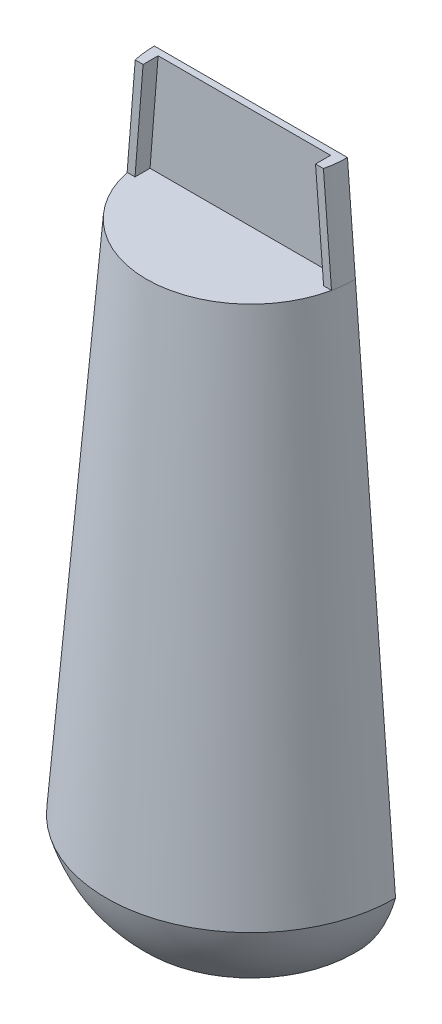
ISO-10303-21;
HEADER;
FILE_DESCRIPTION(('STEP AP214'),'2;1');
FILE_NAME('part.step','',(''),(''),'','','');
FILE_SCHEMA(('AUTOMOTIVE_DESIGN { 1 0 10303 214 1 1 1 1 }'));
ENDSEC;
DATA;
#1=APPLICATION_CONTEXT('core data for automotive mechanical design processes');
#2=APPLICATION_PROTOCOL_DEFINITION('international standard','automotive_design',2000,#1);
#3=PRODUCT_CONTEXT('',#1,'mechanical');
#4=PRODUCT('Part','Part','',(#3));
#5=PRODUCT_RELATED_PRODUCT_CATEGORY('part','',(#4));
#6=PRODUCT_DEFINITION_FORMATION('','',#4);
#7=PRODUCT_DEFINITION_CONTEXT('part definition',#1,'design');
#8=PRODUCT_DEFINITION('design','',#6,#7);
#9=PRODUCT_DEFINITION_SHAPE('','',#8);
#10=(LENGTH_UNIT() NAMED_UNIT(*) SI_UNIT(.MILLI.,.METRE.));
#11=(NAMED_UNIT(*) PLANE_ANGLE_UNIT() SI_UNIT($,.RADIAN.));
#12=(NAMED_UNIT(*) SI_UNIT($,.STERADIAN.) SOLID_ANGLE_UNIT());
#13=UNCERTAINTY_MEASURE_WITH_UNIT(LENGTH_MEASURE(1.E-05),#10,'distance_accuracy_value','');
#14=(GEOMETRIC_REPRESENTATION_CONTEXT(3) GLOBAL_UNCERTAINTY_ASSIGNED_CONTEXT((#13)) GLOBAL_UNIT_ASSIGNED_CONTEXT((#10,
#11,#12)) REPRESENTATION_CONTEXT('',''));
#15=CARTESIAN_POINT('',(0.,0.,0.));
#16=DIRECTION('',(0.,0.,1.));
#17=DIRECTION('',(1.,0.,0.));
#18=AXIS2_PLACEMENT_3D('',#15,#16,#17);
#19=CARTESIAN_POINT('',(0.,18.669,0.));
#20=DIRECTION('',(0.,-1.,0.));
#21=DIRECTION('',(1.,0.,0.));
#22=AXIS2_PLACEMENT_3D('',#19,#20,#21);
#23=CONICAL_SURFACE('',#22,39.0906,0.0776971541820066);
#24=CARTESIAN_POINT('',(0.,158.115,0.));
#25=DIRECTION('',(0.,1.,0.));
#26=DIRECTION('',(0.,0.,1.));
#27=AXIS2_PLACEMENT_3D('',#24,#25,#26);
#28=CIRCLE('',#27,28.2341876712329);
#29=CARTESIAN_POINT('',(-28.2341876712329,158.115,-1.97158278743009E-13));
#30=VERTEX_POINT('',#29);
#31=CARTESIAN_POINT('',(-27.6231857224035,158.115,5.842));
#32=VERTEX_POINT('',#31);
#33=EDGE_CURVE('E469',#30,#32,#28,.T.);
#34=ORIENTED_EDGE('',*,*,#33,.T.);
#35=CARTESIAN_POINT('',(-27.6232016375922,158.1148,5.842));
#36=CARTESIAN_POINT('',(-27.2593982625656,162.686921791537,5.842));
#37=CARTESIAN_POINT('',(-26.8952491497591,167.259016020125,5.842));
#38=CARTESIAN_POINT('',(-26.1662594484225,176.403149353458,5.842));
#39=CARTESIAN_POINT('',(-25.8014188598921,180.975188458204,5.842));
#40=CARTESIAN_POINT('',(-25.4362325335816,185.5472,5.842));
#41=B_SPLINE_CURVE_WITH_KNOTS('',3,(#35,#36,#37,#38,#39,#40),.UNSPECIFIED.,.F.,.F.,(4,2,4),(0.,
13.7597184528974,27.5194369119808),.UNSPECIFIED.);
#42=CARTESIAN_POINT('',(-25.4362485097547,185.547,5.842));
#43=VERTEX_POINT('',#42);
#44=EDGE_CURVE('E12',#32,#43,#41,.T.);
#45=ORIENTED_EDGE('',*,*,#44,.T.);
#46=CARTESIAN_POINT('',(0.,185.547,0.));
#47=DIRECTION('',(0.,1.,0.));
#48=DIRECTION('',(-1.,0.,0.));
#49=AXIS2_PLACEMENT_3D('',#46,#47,#48);
#50=CIRCLE('',#49,26.0985);
#51=CARTESIAN_POINT('',(-26.0985,185.547,-1.82244851443595E-13));
#52=VERTEX_POINT('',#51);
#53=EDGE_CURVE('E467',#52,#43,#50,.T.);
#54=ORIENTED_EDGE('',*,*,#53,.F.);
#55=DIRECTION('',(0.0776190034596369,0.996983094290938,0.));
#56=VECTOR('',#55,1.);
#57=CARTESIAN_POINT('',(-26.0985,185.547,-1.82244851443595E-13));
#58=LINE('',#57,#56);
#59=EDGE_CURVE('E371',#30,#52,#58,.T.);
#60=ORIENTED_EDGE('',*,*,#59,.F.);
#61=EDGE_LOOP('',(#34,#45,#54,#60));
#62=FACE_BOUND('',#61,.T.);
#63=ADVANCED_FACE('F86',(#62),#23,.T.);
#64=ORIENTED_EDGE('',*,*,#33,.F.);
#65=CARTESIAN_POINT('',(-39.0906,18.669,-2.72968200848363E-13));
#66=VERTEX_POINT('',#65);
#67=EDGE_CURVE('E372',#66,#30,#58,.T.);
#68=ORIENTED_EDGE('',*,*,#67,.F.);
#69=CARTESIAN_POINT('',(0.,18.669,0.));
#70=DIRECTION('',(0.,1.,0.));
#71=DIRECTION('',(-1.,0.,0.));
#72=AXIS2_PLACEMENT_3D('',#69,#70,#71);
#73=CIRCLE('',#72,39.0906);
#74=CARTESIAN_POINT('',(39.0906,18.669,0.));
#75=VERTEX_POINT('',#74);
#76=EDGE_CURVE('E478',#66,#75,#73,.T.);
#77=ORIENTED_EDGE('',*,*,#76,.T.);
#78=DIRECTION('',(-0.0776190034596369,0.996983094290938,0.));
#79=VECTOR('',#78,1.);
#80=CARTESIAN_POINT('',(26.0985,185.547,0.));
#81=LINE('',#80,#79);
#82=CARTESIAN_POINT('',(28.2341876712329,158.115,0.));
#83=VERTEX_POINT('',#82);
#84=EDGE_CURVE('E328',#75,#83,#81,.T.);
#85=ORIENTED_EDGE('',*,*,#84,.T.);
#86=CARTESIAN_POINT('',(27.6231857224035,158.115,5.842));
#87=VERTEX_POINT('',#86);
#88=EDGE_CURVE('E112',#87,#83,#28,.T.);
#89=ORIENTED_EDGE('',*,*,#88,.F.);
#90=EDGE_CURVE('E503',#32,#87,#28,.T.);
#91=ORIENTED_EDGE('',*,*,#90,.F.);
#92=EDGE_LOOP('',(#64,#68,#77,#85,#89,#91));
#93=FACE_BOUND('',#92,.T.);
#94=ADVANCED_FACE('F380',(#93),#23,.T.);
#95=CARTESIAN_POINT('',(-27.686,0.,-1.93330304694422E-13));
#96=CARTESIAN_POINT('',(-33.0192378309506,4.97332473532158,-2.30572105419175E-13));
#97=CARTESIAN_POINT('',(-36.7329299606657,10.7341988250569,-2.56504678957392E-13));
#98=CARTESIAN_POINT('',(-39.0906,18.669,-2.72968200848363E-13));
#99=B_SPLINE_CURVE_WITH_KNOTS('',3,(#95,#96,#97,#98),.UNSPECIFIED.,.F.,.F.,(4,4),(0.,1.),.UNSPECIFIED.);
#100=CARTESIAN_POINT('',(0.,18.669,0.));
#101=DIRECTION('',(0.,1.,0.));
#102=AXIS1_PLACEMENT('',#100,#101);
#103=SURFACE_OF_REVOLUTION('',#99,#102);
#104=CARTESIAN_POINT('',(0.,0.,0.));
#105=DIRECTION('',(0.,1.,0.));
#106=DIRECTION('',(-1.,0.,0.));
#107=AXIS2_PLACEMENT_3D('',#104,#105,#106);
#108=CIRCLE('',#107,27.686);
#109=CARTESIAN_POINT('',(-27.686,0.,-1.93330304694422E-13));
#110=VERTEX_POINT('',#109);
#111=CARTESIAN_POINT('',(27.686,0.,0.));
#112=VERTEX_POINT('',#111);
#113=EDGE_CURVE('E500',#110,#112,#108,.T.);
#114=ORIENTED_EDGE('',*,*,#113,.T.);
#115=CARTESIAN_POINT('',(27.686,0.,0.));
#116=CARTESIAN_POINT('',(33.0192378309506,4.97332473532158,0.));
#117=CARTESIAN_POINT('',(36.7329299606657,10.7341988250569,0.));
#118=CARTESIAN_POINT('',(39.0906,18.669,0.));
#119=B_SPLINE_CURVE_WITH_KNOTS('',3,(#115,#116,#117,#118),.UNSPECIFIED.,.F.,.F.,(4,4),(0.,1.),.UNSPECIFIED.);
#120=EDGE_CURVE('E316',#112,#75,#119,.T.);
#121=ORIENTED_EDGE('',*,*,#120,.T.);
#122=ORIENTED_EDGE('',*,*,#76,.F.);
#123=EDGE_CURVE('E365',#110,#66,#99,.T.);
#124=ORIENTED_EDGE('',*,*,#123,.F.);
#125=EDGE_LOOP('',(#114,#121,#122,#124));
#126=FACE_BOUND('',#125,.T.);
#127=ADVANCED_FACE('F377',(#126),#103,.T.);
#128=CARTESIAN_POINT('',(-27.686,0.,-1.93330304694422E-13));
#129=DIRECTION('',(0.,1.,0.));
#130=DIRECTION('',(-1.,0.,0.));
#131=AXIS2_PLACEMENT_3D('',#128,#129,#130);
#132=PLANE('',#131);
#133=CARTESIAN_POINT('',(0.,0.,0.));
#134=DIRECTION('',(0.,1.,0.));
#135=DIRECTION('',(-1.,0.,0.));
#136=AXIS2_PLACEMENT_3D('',#133,#134,#135);
#137=CIRCLE('',#136,22.606);
#138=CARTESIAN_POINT('',(-22.606,0.,-1.57856854291776E-13));
#139=VERTEX_POINT('',#138);
#140=CARTESIAN_POINT('',(22.606,0.,0.));
#141=VERTEX_POINT('',#140);
#142=EDGE_CURVE('E498',#139,#141,#137,.T.);
#143=ORIENTED_EDGE('',*,*,#142,.T.);
#144=DIRECTION('',(1.,0.,0.));
#145=VECTOR('',#144,1.);
#146=CARTESIAN_POINT('',(27.686,0.,0.));
#147=LINE('',#146,#145);
#148=EDGE_CURVE('E362',#141,#112,#147,.T.);
#149=ORIENTED_EDGE('',*,*,#148,.T.);
#150=ORIENTED_EDGE('',*,*,#113,.F.);
#151=DIRECTION('',(-1.,0.,0.));
#152=VECTOR('',#151,1.);
#153=CARTESIAN_POINT('',(-27.686,0.,-1.93330304694422E-13));
#154=LINE('',#153,#152);
#155=EDGE_CURVE('E595',#139,#110,#154,.T.);
#156=ORIENTED_EDGE('',*,*,#155,.F.);
#157=EDGE_LOOP('',(#143,#149,#150,#156));
#158=FACE_BOUND('',#157,.T.);
#159=ADVANCED_FACE('F88',(#158),#132,.F.);
#160=CARTESIAN_POINT('',(0.,18.669,0.));
#161=DIRECTION('',(0.,1.,0.));
#162=DIRECTION('',(-1.,0.,0.));
#163=AXIS2_PLACEMENT_3D('',#160,#161,#162);
#164=CYLINDRICAL_SURFACE('',#163,22.606);
#165=CARTESIAN_POINT('',(0.,1.8288,0.));
#166=DIRECTION('',(0.,1.,0.));
#167=DIRECTION('',(-1.,0.,0.));
#168=AXIS2_PLACEMENT_3D('',#165,#166,#167);
#169=CIRCLE('',#168,22.606);
#170=CARTESIAN_POINT('',(-22.606,1.8288,-1.57856854291776E-13));
#171=VERTEX_POINT('',#170);
#172=CARTESIAN_POINT('',(22.606,1.8288,0.));
#173=VERTEX_POINT('',#172);
#174=EDGE_CURVE('E496',#171,#173,#169,.T.);
#175=ORIENTED_EDGE('',*,*,#174,.T.);
#176=DIRECTION('',(0.,-1.,0.));
#177=VECTOR('',#176,1.);
#178=CARTESIAN_POINT('',(22.606,0.,0.));
#179=LINE('',#178,#177);
#180=EDGE_CURVE('E356',#173,#141,#179,.T.);
#181=ORIENTED_EDGE('',*,*,#180,.T.);
#182=ORIENTED_EDGE('',*,*,#142,.F.);
#183=DIRECTION('',(0.,-1.,0.));
#184=VECTOR('',#183,1.);
#185=CARTESIAN_POINT('',(-22.606,0.,-1.57856854291776E-13));
#186=LINE('',#185,#184);
#187=EDGE_CURVE('E533',#171,#139,#186,.T.);
#188=ORIENTED_EDGE('',*,*,#187,.F.);
#189=EDGE_LOOP('',(#175,#181,#182,#188));
#190=FACE_BOUND('',#189,.T.);
#191=ADVANCED_FACE('F530',(#190),#164,.F.);
#192=CARTESIAN_POINT('',(-28.829,4.191,-2.01311831035017E-13));
#193=CARTESIAN_POINT('',(-27.1068756751907,2.82098245237321,-1.89286301148538E-13));
#194=CARTESIAN_POINT('',(-25.0411680824178,1.8288,-1.74861542125192E-13));
#195=CARTESIAN_POINT('',(-22.606,1.8288,-1.57856854291776E-13));
#196=B_SPLINE_CURVE_WITH_KNOTS('',3,(#192,#193,#194,#195),.UNSPECIFIED.,.F.,.F.,(4,4),(0.,
0.286842677710472),.UNSPECIFIED.);
#197=CARTESIAN_POINT('',(0.,18.669,0.));
#198=DIRECTION('',(0.,1.,0.));
#199=AXIS1_PLACEMENT('',#197,#198);
#200=SURFACE_OF_REVOLUTION('',#196,#199);
#201=CARTESIAN_POINT('',(0.,4.191,0.));
#202=DIRECTION('',(0.,1.,0.));
#203=DIRECTION('',(-1.,0.,0.));
#204=AXIS2_PLACEMENT_3D('',#201,#202,#203);
#205=CIRCLE('',#204,28.829);
#206=CARTESIAN_POINT('',(-28.829,4.191,-2.01311831035017E-13));
#207=VERTEX_POINT('',#206);
#208=CARTESIAN_POINT('',(28.829,4.191,0.));
#209=VERTEX_POINT('',#208);
#210=EDGE_CURVE('E494',#207,#209,#205,.T.);
#211=ORIENTED_EDGE('',*,*,#210,.T.);
#212=CARTESIAN_POINT('',(28.829,4.191,0.));
#213=CARTESIAN_POINT('',(27.1068756751907,2.82098245237321,0.));
#214=CARTESIAN_POINT('',(25.0411680824178,1.8288,0.));
#215=CARTESIAN_POINT('',(22.606,1.8288,0.));
#216=B_SPLINE_CURVE_WITH_KNOTS('',3,(#212,#213,#214,#215),.UNSPECIFIED.,.F.,.F.,(4,4),(0.,
0.286842677710472),.UNSPECIFIED.);
#217=EDGE_CURVE('E351',#209,#173,#216,.T.);
#218=ORIENTED_EDGE('',*,*,#217,.T.);
#219=ORIENTED_EDGE('',*,*,#174,.F.);
#220=EDGE_CURVE('E538',#207,#171,#196,.T.);
#221=ORIENTED_EDGE('',*,*,#220,.F.);
#222=EDGE_LOOP('',(#211,#218,#219,#221));
#223=FACE_BOUND('',#222,.T.);
#224=ADVANCED_FACE('F537',(#223),#200,.T.);
#225=CARTESIAN_POINT('',(-28.829,4.191,-2.01311831035017E-13));
#226=DIRECTION('',(0.,1.,0.));
#227=DIRECTION('',(-1.,0.,0.));
#228=AXIS2_PLACEMENT_3D('',#225,#226,#227);
#229=PLANE('',#228);
#230=CARTESIAN_POINT('',(0.,4.191,0.));
#231=DIRECTION('',(0.,1.,0.));
#232=DIRECTION('',(-1.,0.,0.));
#233=AXIS2_PLACEMENT_3D('',#230,#231,#232);
#234=CIRCLE('',#233,22.606);
#235=CARTESIAN_POINT('',(-22.606,4.191,-1.57856854291776E-13));
#236=VERTEX_POINT('',#235);
#237=CARTESIAN_POINT('',(22.606,4.191,0.));
#238=VERTEX_POINT('',#237);
#239=EDGE_CURVE('E492',#236,#238,#234,.T.);
#240=ORIENTED_EDGE('',*,*,#239,.T.);
#241=DIRECTION('',(1.,0.,0.));
#242=VECTOR('',#241,1.);
#243=CARTESIAN_POINT('',(28.829,4.191,0.));
#244=LINE('',#243,#242);
#245=EDGE_CURVE('E348',#238,#209,#244,.T.);
#246=ORIENTED_EDGE('',*,*,#245,.T.);
#247=ORIENTED_EDGE('',*,*,#210,.F.);
#248=DIRECTION('',(-1.,0.,0.));
#249=VECTOR('',#248,1.);
#250=CARTESIAN_POINT('',(-28.829,4.191,-2.01311831035017E-13));
#251=LINE('',#250,#249);
#252=EDGE_CURVE('E591',#236,#207,#251,.T.);
#253=ORIENTED_EDGE('',*,*,#252,.F.);
#254=EDGE_LOOP('',(#240,#246,#247,#253));
#255=FACE_BOUND('',#254,.T.);
#256=ADVANCED_FACE('F542',(#255),#229,.F.);
#257=CARTESIAN_POINT('',(0.,18.669,0.));
#258=DIRECTION('',(0.,1.,0.));
#259=DIRECTION('',(-1.,0.,0.));
#260=AXIS2_PLACEMENT_3D('',#257,#258,#259);
#261=CYLINDRICAL_SURFACE('',#260,22.606);
#262=CARTESIAN_POINT('',(0.,5.8928,0.));
#263=DIRECTION('',(0.,1.,0.));
#264=DIRECTION('',(-1.,0.,0.));
#265=AXIS2_PLACEMENT_3D('',#262,#263,#264);
#266=CIRCLE('',#265,22.606);
#267=CARTESIAN_POINT('',(-22.606,5.8928,-1.57856854291776E-13));
#268=VERTEX_POINT('',#267);
#269=CARTESIAN_POINT('',(22.606,5.8928,0.));
#270=VERTEX_POINT('',#269);
#271=EDGE_CURVE('E490',#268,#270,#266,.T.);
#272=ORIENTED_EDGE('',*,*,#271,.T.);
#273=DIRECTION('',(0.,-1.,0.));
#274=VECTOR('',#273,1.);
#275=CARTESIAN_POINT('',(22.606,4.191,0.));
#276=LINE('',#275,#274);
#277=EDGE_CURVE('E345',#270,#238,#276,.T.);
#278=ORIENTED_EDGE('',*,*,#277,.T.);
#279=ORIENTED_EDGE('',*,*,#239,.F.);
#280=DIRECTION('',(0.,-1.,0.));
#281=VECTOR('',#280,1.);
#282=CARTESIAN_POINT('',(-22.606,4.191,-1.57856854291776E-13));
#283=LINE('',#282,#281);
#284=EDGE_CURVE('E550',#268,#236,#283,.T.);
#285=ORIENTED_EDGE('',*,*,#284,.F.);
#286=EDGE_LOOP('',(#272,#278,#279,#285));
#287=FACE_BOUND('',#286,.T.);
#288=ADVANCED_FACE('F547',(#287),#261,.F.);
#289=CARTESIAN_POINT('',(-22.606,5.8928,-1.57856854291776E-13));
#290=DIRECTION('',(0.,-1.,0.));
#291=DIRECTION('',(1.,0.,0.));
#292=AXIS2_PLACEMENT_3D('',#289,#290,#291);
#293=PLANE('',#292);
#294=CARTESIAN_POINT('',(0.,5.8928,0.));
#295=DIRECTION('',(0.,1.,0.));
#296=DIRECTION('',(-1.,0.,0.));
#297=AXIS2_PLACEMENT_3D('',#294,#295,#296);
#298=CIRCLE('',#297,30.607);
#299=CARTESIAN_POINT('',(-30.607,5.8928,-2.13727538675944E-13));
#300=VERTEX_POINT('',#299);
#301=CARTESIAN_POINT('',(30.607,5.8928,0.));
#302=VERTEX_POINT('',#301);
#303=EDGE_CURVE('E476',#300,#302,#298,.T.);
#304=ORIENTED_EDGE('',*,*,#303,.T.);
#305=DIRECTION('',(-1.,0.,0.));
#306=VECTOR('',#305,1.);
#307=CARTESIAN_POINT('',(22.606,5.8928,0.));
#308=LINE('',#307,#306);
#309=EDGE_CURVE('E339',#302,#270,#308,.T.);
#310=ORIENTED_EDGE('',*,*,#309,.T.);
#311=ORIENTED_EDGE('',*,*,#271,.F.);
#312=DIRECTION('',(1.,0.,0.));
#313=VECTOR('',#312,1.);
#314=CARTESIAN_POINT('',(-22.606,5.8928,-1.57856854291776E-13));
#315=LINE('',#314,#313);
#316=EDGE_CURVE('E555',#300,#268,#315,.T.);
#317=ORIENTED_EDGE('',*,*,#316,.F.);
#318=EDGE_LOOP('',(#304,#310,#311,#317));
#319=FACE_BOUND('',#318,.T.);
#320=ADVANCED_FACE('F554',(#319),#293,.F.);
#321=CARTESIAN_POINT('',(-36.542913871173,18.669,-2.55177803696305E-13));
#322=CARTESIAN_POINT('',(-35.3264301080205,11.2405574459357,-2.46683142980199E-13));
#323=CARTESIAN_POINT('',(-30.607,5.8928,-2.13727538675944E-13));
#324=B_SPLINE_CURVE_WITH_KNOTS('',2,(#321,#322,#323),.UNSPECIFIED.,.F.,.F.,(3,3),
(0.392904055750511,1.),.UNSPECIFIED.);
#325=CARTESIAN_POINT('',(0.,18.669,0.));
#326=DIRECTION('',(0.,1.,0.));
#327=AXIS1_PLACEMENT('',#325,#326);
#328=SURFACE_OF_REVOLUTION('',#324,#327);
#329=CARTESIAN_POINT('',(0.,18.669,0.));
#330=DIRECTION('',(0.,1.,0.));
#331=DIRECTION('',(-1.,0.,0.));
#332=AXIS2_PLACEMENT_3D('',#329,#330,#331);
#333=CIRCLE('',#332,36.542913871173);
#334=CARTESIAN_POINT('',(-36.542913871173,18.669,-2.55177803696305E-13));
#335=VERTEX_POINT('',#334);
#336=CARTESIAN_POINT('',(36.542913871173,18.669,0.));
#337=VERTEX_POINT('',#336);
#338=EDGE_CURVE('E472',#335,#337,#333,.T.);
#339=ORIENTED_EDGE('',*,*,#338,.T.);
#340=CARTESIAN_POINT('',(36.542913871173,18.669,0.));
#341=CARTESIAN_POINT('',(35.3264301080205,11.2405574459357,0.));
#342=CARTESIAN_POINT('',(30.607,5.8928,0.));
#343=B_SPLINE_CURVE_WITH_KNOTS('',2,(#340,#341,#342),.UNSPECIFIED.,.F.,.F.,(3,3),
(0.392904055750511,1.),.UNSPECIFIED.);
#344=EDGE_CURVE('E334',#337,#302,#343,.T.);
#345=ORIENTED_EDGE('',*,*,#344,.T.);
#346=ORIENTED_EDGE('',*,*,#303,.F.);
#347=EDGE_CURVE('E562',#335,#300,#324,.T.);
#348=ORIENTED_EDGE('',*,*,#347,.F.);
#349=EDGE_LOOP('',(#339,#345,#346,#348));
#350=FACE_BOUND('',#349,.T.);
#351=ADVANCED_FACE('F559',(#350),#328,.T.);
#352=CARTESIAN_POINT('',(-36.542913871173,18.669,-2.55177803696305E-13));
#353=DIRECTION('',(0.,1.,0.));
#354=DIRECTION('',(-1.,0.,0.));
#355=AXIS2_PLACEMENT_3D('',#352,#353,#354);
#356=PLANE('',#355);
#357=DIRECTION('',(-1.,0.,0.));
#358=VECTOR('',#357,1.);
#359=CARTESIAN_POINT('',(-36.542913871173,18.669,-2.55177803696305E-13));
#360=LINE('',#359,#358);
#361=EDGE_CURVE('E561',#337,#335,#360,.T.);
#362=ORIENTED_EDGE('',*,*,#361,.F.);
#363=ORIENTED_EDGE('',*,*,#338,.F.);
#364=EDGE_LOOP('',(#362,#363));
#365=FACE_BOUND('',#364,.T.);
#366=ADVANCED_FACE('F577',(#365),#356,.F.);
#367=CARTESIAN_POINT('',(0.,185.547,0.));
#368=DIRECTION('',(0.,-1.,0.));
#369=DIRECTION('',(1.,0.,0.));
#370=AXIS2_PLACEMENT_3D('',#367,#368,#369);
#371=PLANE('',#370);
#372=ORIENTED_EDGE('',*,*,#53,.T.);
#373=DIRECTION('',(-1.,0.,0.));
#374=VECTOR('',#373,1.);
#375=CARTESIAN_POINT('',(-23.3045,185.547,5.842));
#376=LINE('',#375,#374);
#377=CARTESIAN_POINT('',(-23.3045,185.547,5.842));
#378=VERTEX_POINT('',#377);
#379=EDGE_CURVE('E234',#378,#43,#376,.T.);
#380=ORIENTED_EDGE('',*,*,#379,.F.);
#381=DIRECTION('',(0.,0.,1.));
#382=VECTOR('',#381,1.);
#383=CARTESIAN_POINT('',(-23.3045,185.547,1.77799999999999));
#384=LINE('',#383,#382);
#385=CARTESIAN_POINT('',(-23.3045,185.547,1.77799999999999));
#386=VERTEX_POINT('',#385);
#387=EDGE_CURVE('E221',#386,#378,#384,.T.);
#388=ORIENTED_EDGE('',*,*,#387,.F.);
#389=DIRECTION('',(-1.,0.,0.));
#390=VECTOR('',#389,1.);
#391=CARTESIAN_POINT('',(-23.3045,185.547,1.77799999999999));
#392=LINE('',#391,#390);
#393=CARTESIAN_POINT('',(23.3045,185.547,1.778));
#394=VERTEX_POINT('',#393);
#395=EDGE_CURVE('E209',#394,#386,#392,.T.);
#396=ORIENTED_EDGE('',*,*,#395,.F.);
#397=DIRECTION('',(0.,0.,-1.));
#398=VECTOR('',#397,1.);
#399=CARTESIAN_POINT('',(23.3045,185.547,1.778));
#400=LINE('',#399,#398);
#401=CARTESIAN_POINT('',(23.3045,185.547,5.842));
#402=VERTEX_POINT('',#401);
#403=EDGE_CURVE('E243',#402,#394,#400,.T.);
#404=ORIENTED_EDGE('',*,*,#403,.F.);
#405=DIRECTION('',(-1.,0.,0.));
#406=VECTOR('',#405,1.);
#407=CARTESIAN_POINT('',(23.3045,185.547,5.842));
#408=LINE('',#407,#406);
#409=CARTESIAN_POINT('',(25.4362485097547,185.547,5.842));
#410=VERTEX_POINT('',#409);
#411=EDGE_CURVE('E236',#410,#402,#408,.T.);
#412=ORIENTED_EDGE('',*,*,#411,.F.);
#413=CARTESIAN_POINT('',(26.0985,185.547,0.));
#414=VERTEX_POINT('',#413);
#415=EDGE_CURVE('E473',#410,#414,#50,.T.);
#416=ORIENTED_EDGE('',*,*,#415,.T.);
#417=DIRECTION('',(1.,0.,0.));
#418=VECTOR('',#417,1.);
#419=CARTESIAN_POINT('',(0.,185.547,0.));
#420=LINE('',#419,#418);
#421=EDGE_CURVE('E471',#52,#414,#420,.T.);
#422=ORIENTED_EDGE('',*,*,#421,.F.);
#423=EDGE_LOOP('',(#372,#380,#388,#396,#404,#412,#416,#422));
#424=FACE_BOUND('',#423,.T.);
#425=ADVANCED_FACE('F233',(#424),#371,.F.);
#426=ORIENTED_EDGE('',*,*,#415,.F.);
#427=CARTESIAN_POINT('',(25.4362325335816,185.5472,5.842));
#428=CARTESIAN_POINT('',(25.8014188598921,180.975188458204,5.842));
#429=CARTESIAN_POINT('',(26.1662594484225,176.403149353458,5.842));
#430=CARTESIAN_POINT('',(26.8952491497591,167.259016020125,5.842));
#431=CARTESIAN_POINT('',(27.2593982625656,162.686921791537,5.842));
#432=CARTESIAN_POINT('',(27.6232016375922,158.1148,5.842));
#433=B_SPLINE_CURVE_WITH_KNOTS('',3,(#427,#428,#429,#430,#431,#432),.UNSPECIFIED.,.F.,.F.,(4,2,
4),(0.,13.7597184590834,27.5194369119809),.UNSPECIFIED.);
#434=EDGE_CURVE('E95',#410,#87,#433,.T.);
#435=ORIENTED_EDGE('',*,*,#434,.T.);
#436=ORIENTED_EDGE('',*,*,#88,.T.);
#437=EDGE_CURVE('E326',#83,#414,#81,.T.);
#438=ORIENTED_EDGE('',*,*,#437,.T.);
#439=EDGE_LOOP('',(#426,#435,#436,#438));
#440=FACE_BOUND('',#439,.T.);
#441=ADVANCED_FACE('F382',(#440),#23,.T.);
#442=CARTESIAN_POINT('',(-34.5041379218561,8.22394633514194,-2.40941107334061E-13));
#443=DIRECTION('',(0.,0.,1.));
#444=DIRECTION('',(1.,0.,0.));
#445=AXIS2_PLACEMENT_3D('',#442,#443,#444);
#446=PLANE('',#445);
#447=ORIENTED_EDGE('',*,*,#123,.T.);
#448=ORIENTED_EDGE('',*,*,#67,.T.);
#449=ORIENTED_EDGE('',*,*,#59,.T.);
#450=ORIENTED_EDGE('',*,*,#421,.T.);
#451=ORIENTED_EDGE('',*,*,#437,.F.);
#452=ORIENTED_EDGE('',*,*,#84,.F.);
#453=ORIENTED_EDGE('',*,*,#120,.F.);
#454=ORIENTED_EDGE('',*,*,#148,.F.);
#455=ORIENTED_EDGE('',*,*,#180,.F.);
#456=ORIENTED_EDGE('',*,*,#217,.F.);
#457=ORIENTED_EDGE('',*,*,#245,.F.);
#458=ORIENTED_EDGE('',*,*,#277,.F.);
#459=ORIENTED_EDGE('',*,*,#309,.F.);
#460=ORIENTED_EDGE('',*,*,#344,.F.);
#461=ORIENTED_EDGE('',*,*,#361,.T.);
#462=ORIENTED_EDGE('',*,*,#347,.T.);
#463=ORIENTED_EDGE('',*,*,#316,.T.);
#464=ORIENTED_EDGE('',*,*,#284,.T.);
#465=ORIENTED_EDGE('',*,*,#252,.T.);
#466=ORIENTED_EDGE('',*,*,#220,.T.);
#467=ORIENTED_EDGE('',*,*,#187,.T.);
#468=ORIENTED_EDGE('',*,*,#155,.T.);
#469=EDGE_LOOP('',(#447,#448,#449,#450,#451,#452,#453,#454,#455,#456,#457,#458,#459,#460,#461,
#462,#463,#464,#465,#466,#467,#468));
#470=FACE_BOUND('',#469,.T.);
#471=ADVANCED_FACE('F283',(#470),#446,.F.);
#472=CARTESIAN_POINT('',(0.,158.115,0.));
#473=DIRECTION('',(0.,1.,0.));
#474=DIRECTION('',(0.,0.,1.));
#475=AXIS2_PLACEMENT_3D('',#472,#473,#474);
#476=PLANE('',#475);
#477=ORIENTED_EDGE('',*,*,#90,.T.);
#478=DIRECTION('',(-1.,0.,0.));
#479=VECTOR('',#478,1.);
#480=CARTESIAN_POINT('',(25.4914372126488,158.115,5.842));
#481=LINE('',#480,#479);
#482=CARTESIAN_POINT('',(25.4914372126488,158.115,5.842));
#483=VERTEX_POINT('',#482);
#484=EDGE_CURVE('E103',#87,#483,#481,.T.);
#485=ORIENTED_EDGE('',*,*,#484,.T.);
#486=DIRECTION('',(0.,0.,-1.));
#487=VECTOR('',#486,1.);
#488=CARTESIAN_POINT('',(25.4914372126488,158.115,1.778));
#489=LINE('',#488,#487);
#490=CARTESIAN_POINT('',(25.4914372126488,158.115,1.778));
#491=VERTEX_POINT('',#490);
#492=EDGE_CURVE('E312',#483,#491,#489,.T.);
#493=ORIENTED_EDGE('',*,*,#492,.T.);
#494=DIRECTION('',(-1.,0.,0.));
#495=VECTOR('',#494,1.);
#496=CARTESIAN_POINT('',(-25.4914372126488,158.115,1.778));
#497=LINE('',#496,#495);
#498=CARTESIAN_POINT('',(-25.4914372126488,158.115,1.778));
#499=VERTEX_POINT('',#498);
#500=EDGE_CURVE('E327',#491,#499,#497,.T.);
#501=ORIENTED_EDGE('',*,*,#500,.T.);
#502=DIRECTION('',(0.,0.,1.));
#503=VECTOR('',#502,1.);
#504=CARTESIAN_POINT('',(-25.4914372126488,158.115,1.778));
#505=LINE('',#504,#503);
#506=CARTESIAN_POINT('',(-25.4914372126488,158.115,5.842));
#507=VERTEX_POINT('',#506);
#508=EDGE_CURVE('E228',#499,#507,#505,.T.);
#509=ORIENTED_EDGE('',*,*,#508,.T.);
#510=DIRECTION('',(-1.,0.,0.));
#511=VECTOR('',#510,1.);
#512=CARTESIAN_POINT('',(-25.4914372126488,158.115,5.842));
#513=LINE('',#512,#511);
#514=EDGE_CURVE('E251',#507,#32,#513,.T.);
#515=ORIENTED_EDGE('',*,*,#514,.T.);
#516=EDGE_LOOP('',(#477,#485,#493,#501,#509,#515));
#517=FACE_BOUND('',#516,.T.);
#518=ADVANCED_FACE('F272',(#517),#476,.T.);
#519=CARTESIAN_POINT('',(-28.0363107103984,185.547,5.842));
#520=DIRECTION('',(0.,0.,-1.));
#521=DIRECTION('',(1.,0.,0.));
#522=AXIS2_PLACEMENT_3D('',#519,#520,#521);
#523=PLANE('',#522);
#524=ORIENTED_EDGE('',*,*,#514,.F.);
#525=DIRECTION('',(-0.0794699802456244,-0.99683725965664,0.));
#526=VECTOR('',#525,1.);
#527=CARTESIAN_POINT('',(-24.3979686063244,171.831,5.842));
#528=LINE('',#527,#526);
#529=EDGE_CURVE('E220',#378,#507,#528,.T.);
#530=ORIENTED_EDGE('',*,*,#529,.F.);
#531=ORIENTED_EDGE('',*,*,#379,.T.);
#532=ORIENTED_EDGE('',*,*,#44,.F.);
#533=EDGE_LOOP('',(#524,#530,#531,#532));
#534=FACE_BOUND('',#533,.T.);
#535=ADVANCED_FACE('F282',(#534),#523,.F.);
#536=CARTESIAN_POINT('',(23.3045,185.547,5.842));
#537=DIRECTION('',(0.,0.,-1.));
#538=DIRECTION('',(1.,0.,0.));
#539=AXIS2_PLACEMENT_3D('',#536,#537,#538);
#540=PLANE('',#539);
#541=ORIENTED_EDGE('',*,*,#411,.T.);
#542=DIRECTION('',(0.0794699802456245,-0.99683725965664,0.));
#543=VECTOR('',#542,1.);
#544=CARTESIAN_POINT('',(24.3979686063244,171.831,5.842));
#545=LINE('',#544,#543);
#546=EDGE_CURVE('E457',#402,#483,#545,.T.);
#547=ORIENTED_EDGE('',*,*,#546,.T.);
#548=ORIENTED_EDGE('',*,*,#484,.F.);
#549=ORIENTED_EDGE('',*,*,#434,.F.);
#550=EDGE_LOOP('',(#541,#547,#548,#549));
#551=FACE_BOUND('',#550,.T.);
#552=ADVANCED_FACE('F402',(#551),#540,.F.);
#553=CARTESIAN_POINT('',(-23.3045,185.547,5.842));
#554=DIRECTION('',(-0.99683725965664,0.0794699802456244,0.));
#555=DIRECTION('',(0.,0.,-1.));
#556=AXIS2_PLACEMENT_3D('',#553,#554,#555);
#557=PLANE('',#556);
#558=ORIENTED_EDGE('',*,*,#387,.T.);
#559=ORIENTED_EDGE('',*,*,#529,.T.);
#560=ORIENTED_EDGE('',*,*,#508,.F.);
#561=DIRECTION('',(-0.0794699802456245,-0.99683725965664,0.));
#562=VECTOR('',#561,1.);
#563=CARTESIAN_POINT('',(-24.3979686063244,171.831,1.778));
#564=LINE('',#563,#562);
#565=EDGE_CURVE('E212',#386,#499,#564,.T.);
#566=ORIENTED_EDGE('',*,*,#565,.F.);
#567=EDGE_LOOP('',(#558,#559,#560,#566));
#568=FACE_BOUND('',#567,.T.);
#569=ADVANCED_FACE('F225',(#568),#557,.F.);
#570=CARTESIAN_POINT('',(-23.3045,185.547,1.77799999999999));
#571=DIRECTION('',(0.,0.,-1.));
#572=DIRECTION('',(1.,0.,0.));
#573=AXIS2_PLACEMENT_3D('',#570,#571,#572);
#574=PLANE('',#573);
#575=ORIENTED_EDGE('',*,*,#395,.T.);
#576=ORIENTED_EDGE('',*,*,#565,.T.);
#577=ORIENTED_EDGE('',*,*,#500,.F.);
#578=DIRECTION('',(0.0794699802456245,-0.99683725965664,0.));
#579=VECTOR('',#578,1.);
#580=CARTESIAN_POINT('',(24.3979686063244,171.831,1.778));
#581=LINE('',#580,#579);
#582=EDGE_CURVE('E215',#394,#491,#581,.T.);
#583=ORIENTED_EDGE('',*,*,#582,.F.);
#584=EDGE_LOOP('',(#575,#576,#577,#583));
#585=FACE_BOUND('',#584,.T.);
#586=ADVANCED_FACE('F211',(#585),#574,.F.);
#587=CARTESIAN_POINT('',(23.3045,185.547,1.778));
#588=DIRECTION('',(0.99683725965664,0.0794699802456245,0.));
#589=DIRECTION('',(0.,0.,1.));
#590=AXIS2_PLACEMENT_3D('',#587,#588,#589);
#591=PLANE('',#590);
#592=ORIENTED_EDGE('',*,*,#403,.T.);
#593=ORIENTED_EDGE('',*,*,#582,.T.);
#594=ORIENTED_EDGE('',*,*,#492,.F.);
#595=ORIENTED_EDGE('',*,*,#546,.F.);
#596=EDGE_LOOP('',(#592,#593,#594,#595));
#597=FACE_BOUND('',#596,.T.);
#598=ADVANCED_FACE('F284',(#597),#591,.F.);
#599=CLOSED_SHELL('',(#63,#94,#127,#159,#191,#224,#256,#288,#320,#351,#366,#425,#441,#471,#518,
#535,#552,#569,#586,#598));
#600=MANIFOLD_SOLID_BREP('B2',#599);
#601=ADVANCED_BREP_SHAPE_REPRESENTATION('',(#18,#600),#14);
#602=SHAPE_DEFINITION_REPRESENTATION(#9,#601);
ENDSEC;
END-ISO-10303-21;
